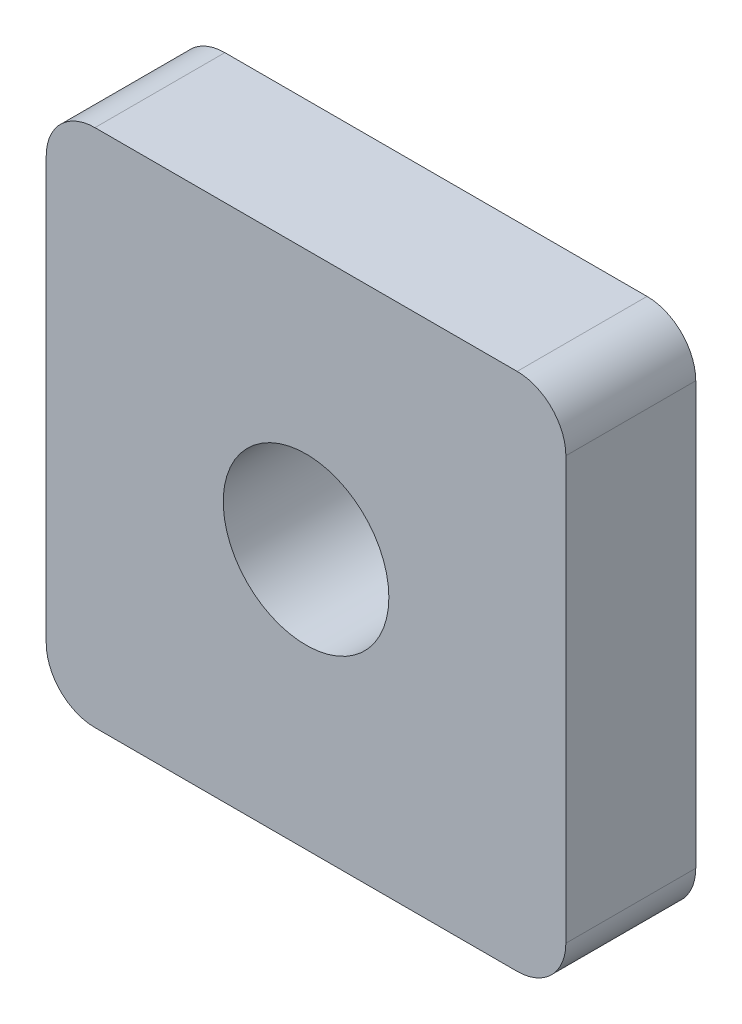
ISO-10303-21;
HEADER;
FILE_DESCRIPTION(('STEP AP214'),'2;1');
FILE_NAME('part.step','',(''),(''),'','','');
FILE_SCHEMA(('AUTOMOTIVE_DESIGN { 1 0 10303 214 1 1 1 1 }'));
ENDSEC;
DATA;
#1=APPLICATION_CONTEXT('core data for automotive mechanical design processes');
#2=APPLICATION_PROTOCOL_DEFINITION('international standard','automotive_design',2000,#1);
#3=PRODUCT_CONTEXT('',#1,'mechanical');
#4=PRODUCT('Part','Part','',(#3));
#5=PRODUCT_RELATED_PRODUCT_CATEGORY('part','',(#4));
#6=PRODUCT_DEFINITION_FORMATION('','',#4);
#7=PRODUCT_DEFINITION_CONTEXT('part definition',#1,'design');
#8=PRODUCT_DEFINITION('design','',#6,#7);
#9=PRODUCT_DEFINITION_SHAPE('','',#8);
#10=(LENGTH_UNIT() NAMED_UNIT(*) SI_UNIT(.MILLI.,.METRE.));
#11=(NAMED_UNIT(*) PLANE_ANGLE_UNIT() SI_UNIT($,.RADIAN.));
#12=(NAMED_UNIT(*) SI_UNIT($,.STERADIAN.) SOLID_ANGLE_UNIT());
#13=UNCERTAINTY_MEASURE_WITH_UNIT(LENGTH_MEASURE(1.E-05),#10,'distance_accuracy_value','');
#14=(GEOMETRIC_REPRESENTATION_CONTEXT(3) GLOBAL_UNCERTAINTY_ASSIGNED_CONTEXT((#13)) GLOBAL_UNIT_ASSIGNED_CONTEXT((#10,
#11,#12)) REPRESENTATION_CONTEXT('',''));
#15=CARTESIAN_POINT('',(0.,0.,0.));
#16=DIRECTION('',(0.,0.,1.));
#17=DIRECTION('',(1.,0.,0.));
#18=AXIS2_PLACEMENT_3D('',#15,#16,#17);
#19=CARTESIAN_POINT('',(16.,16.,8.));
#20=DIRECTION('',(-1.,0.,0.));
#21=DIRECTION('',(0.,-1.,0.));
#22=AXIS2_PLACEMENT_3D('',#19,#20,#21);
#23=PLANE('',#22);
#24=DIRECTION('',(0.,1.,0.));
#25=VECTOR('',#24,1.);
#26=CARTESIAN_POINT('',(16.,16.,8.));
#27=LINE('',#26,#25);
#28=CARTESIAN_POINT('',(16.,-13.,8.));
#29=VERTEX_POINT('',#28);
#30=CARTESIAN_POINT('',(16.,13.,8.));
#31=VERTEX_POINT('',#30);
#32=EDGE_CURVE('E131',#29,#31,#27,.T.);
#33=ORIENTED_EDGE('',*,*,#32,.F.);
#34=DIRECTION('',(0.,0.,-1.));
#35=VECTOR('',#34,1.);
#36=CARTESIAN_POINT('',(16.,-13.,8.));
#37=LINE('',#36,#35);
#38=CARTESIAN_POINT('',(16.,-13.,0.));
#39=VERTEX_POINT('',#38);
#40=EDGE_CURVE('E157',#29,#39,#37,.T.);
#41=ORIENTED_EDGE('',*,*,#40,.T.);
#42=DIRECTION('',(0.,1.,0.));
#43=VECTOR('',#42,1.);
#44=CARTESIAN_POINT('',(16.,16.,0.));
#45=LINE('',#44,#43);
#46=CARTESIAN_POINT('',(16.,13.,0.));
#47=VERTEX_POINT('',#46);
#48=EDGE_CURVE('E163',#39,#47,#45,.T.);
#49=ORIENTED_EDGE('',*,*,#48,.T.);
#50=DIRECTION('',(0.,0.,-1.));
#51=VECTOR('',#50,1.);
#52=CARTESIAN_POINT('',(16.,13.,8.));
#53=LINE('',#52,#51);
#54=EDGE_CURVE('E155',#47,#31,#53,.F.);
#55=ORIENTED_EDGE('',*,*,#54,.T.);
#56=EDGE_LOOP('',(#33,#41,#49,#55));
#57=FACE_BOUND('',#56,.T.);
#58=ADVANCED_FACE('F39',(#57),#23,.F.);
#59=CARTESIAN_POINT('',(-16.,16.,8.));
#60=DIRECTION('',(0.,-1.,0.));
#61=DIRECTION('',(0.,0.,-1.));
#62=AXIS2_PLACEMENT_3D('',#59,#60,#61);
#63=PLANE('',#62);
#64=DIRECTION('',(-1.,0.,0.));
#65=VECTOR('',#64,1.);
#66=CARTESIAN_POINT('',(-16.,16.,8.));
#67=LINE('',#66,#65);
#68=CARTESIAN_POINT('',(13.,16.,8.));
#69=VERTEX_POINT('',#68);
#70=CARTESIAN_POINT('',(-13.,16.,8.));
#71=VERTEX_POINT('',#70);
#72=EDGE_CURVE('E134',#69,#71,#67,.T.);
#73=ORIENTED_EDGE('',*,*,#72,.F.);
#74=DIRECTION('',(0.,0.,-1.));
#75=VECTOR('',#74,1.);
#76=CARTESIAN_POINT('',(13.,16.,8.));
#77=LINE('',#76,#75);
#78=CARTESIAN_POINT('',(13.,16.,0.));
#79=VERTEX_POINT('',#78);
#80=EDGE_CURVE('E11',#69,#79,#77,.T.);
#81=ORIENTED_EDGE('',*,*,#80,.T.);
#82=DIRECTION('',(-1.,0.,0.));
#83=VECTOR('',#82,1.);
#84=CARTESIAN_POINT('',(-16.,16.,0.));
#85=LINE('',#84,#83);
#86=CARTESIAN_POINT('',(-13.,16.,0.));
#87=VERTEX_POINT('',#86);
#88=EDGE_CURVE('E136',#79,#87,#85,.T.);
#89=ORIENTED_EDGE('',*,*,#88,.T.);
#90=DIRECTION('',(0.,0.,-1.));
#91=VECTOR('',#90,1.);
#92=CARTESIAN_POINT('',(-13.,16.,8.));
#93=LINE('',#92,#91);
#94=EDGE_CURVE('E47',#87,#71,#93,.F.);
#95=ORIENTED_EDGE('',*,*,#94,.T.);
#96=EDGE_LOOP('',(#73,#81,#89,#95));
#97=FACE_BOUND('',#96,.T.);
#98=ADVANCED_FACE('F193',(#97),#63,.F.);
#99=CARTESIAN_POINT('',(-16.,16.,8.));
#100=DIRECTION('',(1.,0.,0.));
#101=DIRECTION('',(0.,1.,0.));
#102=AXIS2_PLACEMENT_3D('',#99,#100,#101);
#103=PLANE('',#102);
#104=DIRECTION('',(0.,-1.,0.));
#105=VECTOR('',#104,1.);
#106=CARTESIAN_POINT('',(-16.,16.,0.));
#107=LINE('',#106,#105);
#108=CARTESIAN_POINT('',(-16.,13.,0.));
#109=VERTEX_POINT('',#108);
#110=CARTESIAN_POINT('',(-16.,-13.,0.));
#111=VERTEX_POINT('',#110);
#112=EDGE_CURVE('E132',#109,#111,#107,.T.);
#113=ORIENTED_EDGE('',*,*,#112,.T.);
#114=DIRECTION('',(0.,0.,-1.));
#115=VECTOR('',#114,1.);
#116=CARTESIAN_POINT('',(-16.,-13.,8.));
#117=LINE('',#116,#115);
#118=CARTESIAN_POINT('',(-16.,-13.,8.));
#119=VERTEX_POINT('',#118);
#120=EDGE_CURVE('E110',#111,#119,#117,.F.);
#121=ORIENTED_EDGE('',*,*,#120,.T.);
#122=DIRECTION('',(0.,-1.,0.));
#123=VECTOR('',#122,1.);
#124=CARTESIAN_POINT('',(-16.,16.,8.));
#125=LINE('',#124,#123);
#126=CARTESIAN_POINT('',(-16.,13.,8.));
#127=VERTEX_POINT('',#126);
#128=EDGE_CURVE('E175',#127,#119,#125,.T.);
#129=ORIENTED_EDGE('',*,*,#128,.F.);
#130=DIRECTION('',(0.,0.,-1.));
#131=VECTOR('',#130,1.);
#132=CARTESIAN_POINT('',(-16.,13.,8.));
#133=LINE('',#132,#131);
#134=EDGE_CURVE('E115',#127,#109,#133,.T.);
#135=ORIENTED_EDGE('',*,*,#134,.T.);
#136=EDGE_LOOP('',(#113,#121,#129,#135));
#137=FACE_BOUND('',#136,.T.);
#138=ADVANCED_FACE('F191',(#137),#103,.F.);
#139=CARTESIAN_POINT('',(-16.,-16.,8.));
#140=DIRECTION('',(0.,1.,0.));
#141=DIRECTION('',(-1.,0.,0.));
#142=AXIS2_PLACEMENT_3D('',#139,#140,#141);
#143=PLANE('',#142);
#144=DIRECTION('',(1.,0.,0.));
#145=VECTOR('',#144,1.);
#146=CARTESIAN_POINT('',(-16.,-16.,8.));
#147=LINE('',#146,#145);
#148=CARTESIAN_POINT('',(-13.,-16.,8.));
#149=VERTEX_POINT('',#148);
#150=CARTESIAN_POINT('',(13.,-16.,8.));
#151=VERTEX_POINT('',#150);
#152=EDGE_CURVE('E125',#149,#151,#147,.T.);
#153=ORIENTED_EDGE('',*,*,#152,.F.);
#154=DIRECTION('',(0.,0.,-1.));
#155=VECTOR('',#154,1.);
#156=CARTESIAN_POINT('',(-13.,-16.,8.));
#157=LINE('',#156,#155);
#158=CARTESIAN_POINT('',(-13.,-16.,0.));
#159=VERTEX_POINT('',#158);
#160=EDGE_CURVE('E109',#149,#159,#157,.T.);
#161=ORIENTED_EDGE('',*,*,#160,.T.);
#162=DIRECTION('',(1.,0.,0.));
#163=VECTOR('',#162,1.);
#164=CARTESIAN_POINT('',(-16.,-16.,0.));
#165=LINE('',#164,#163);
#166=CARTESIAN_POINT('',(13.,-16.,0.));
#167=VERTEX_POINT('',#166);
#168=EDGE_CURVE('E122',#159,#167,#165,.T.);
#169=ORIENTED_EDGE('',*,*,#168,.T.);
#170=DIRECTION('',(0.,0.,-1.));
#171=VECTOR('',#170,1.);
#172=CARTESIAN_POINT('',(13.,-16.,8.));
#173=LINE('',#172,#171);
#174=EDGE_CURVE('E127',#167,#151,#173,.F.);
#175=ORIENTED_EDGE('',*,*,#174,.T.);
#176=EDGE_LOOP('',(#153,#161,#169,#175));
#177=FACE_BOUND('',#176,.T.);
#178=ADVANCED_FACE('F121',(#177),#143,.F.);
#179=CARTESIAN_POINT('',(0.,0.,8.));
#180=DIRECTION('',(0.,0.,1.));
#181=DIRECTION('',(1.,0.,0.));
#182=AXIS2_PLACEMENT_3D('',#179,#180,#181);
#183=PLANE('',#182);
#184=CARTESIAN_POINT('',(0.,0.,8.));
#185=DIRECTION('',(0.,0.,1.));
#186=DIRECTION('',(1.,0.,0.));
#187=AXIS2_PLACEMENT_3D('',#184,#185,#186);
#188=CIRCLE('',#187,5.1);
#189=CARTESIAN_POINT('',(5.1,0.,8.));
#190=VERTEX_POINT('',#189);
#191=EDGE_CURVE('E171',#190,#190,#188,.T.);
#192=ORIENTED_EDGE('',*,*,#191,.F.);
#193=EDGE_LOOP('',(#192));
#194=FACE_BOUND('',#193,.T.);
#195=ORIENTED_EDGE('',*,*,#128,.T.);
#196=CARTESIAN_POINT('',(-13.,-13.,8.));
#197=DIRECTION('',(0.,0.,1.));
#198=DIRECTION('',(1.,0.,0.));
#199=AXIS2_PLACEMENT_3D('',#196,#197,#198);
#200=CIRCLE('',#199,3.);
#201=EDGE_CURVE('E153',#119,#149,#200,.T.);
#202=ORIENTED_EDGE('',*,*,#201,.T.);
#203=ORIENTED_EDGE('',*,*,#152,.T.);
#204=CARTESIAN_POINT('',(13.,-13.,8.));
#205=DIRECTION('',(0.,0.,1.));
#206=DIRECTION('',(1.,0.,0.));
#207=AXIS2_PLACEMENT_3D('',#204,#205,#206);
#208=CIRCLE('',#207,3.);
#209=EDGE_CURVE('E151',#151,#29,#208,.T.);
#210=ORIENTED_EDGE('',*,*,#209,.T.);
#211=ORIENTED_EDGE('',*,*,#32,.T.);
#212=CARTESIAN_POINT('',(13.,13.,8.));
#213=DIRECTION('',(0.,0.,1.));
#214=DIRECTION('',(1.,0.,0.));
#215=AXIS2_PLACEMENT_3D('',#212,#213,#214);
#216=CIRCLE('',#215,3.);
#217=EDGE_CURVE('E60',#31,#69,#216,.T.);
#218=ORIENTED_EDGE('',*,*,#217,.T.);
#219=ORIENTED_EDGE('',*,*,#72,.T.);
#220=CARTESIAN_POINT('',(-13.,13.,8.));
#221=DIRECTION('',(0.,0.,1.));
#222=DIRECTION('',(1.,0.,0.));
#223=AXIS2_PLACEMENT_3D('',#220,#221,#222);
#224=CIRCLE('',#223,3.);
#225=EDGE_CURVE('E148',#71,#127,#224,.T.);
#226=ORIENTED_EDGE('',*,*,#225,.T.);
#227=EDGE_LOOP('',(#195,#202,#203,#210,#211,#218,#219,#226));
#228=FACE_BOUND('',#227,.T.);
#229=ADVANCED_FACE('F184',(#194,#228),#183,.T.);
#230=CARTESIAN_POINT('',(0.,0.,0.));
#231=DIRECTION('',(0.,0.,1.));
#232=DIRECTION('',(1.,0.,0.));
#233=AXIS2_PLACEMENT_3D('',#230,#231,#232);
#234=PLANE('',#233);
#235=CARTESIAN_POINT('',(0.,0.,0.));
#236=DIRECTION('',(0.,0.,1.));
#237=DIRECTION('',(1.,0.,0.));
#238=AXIS2_PLACEMENT_3D('',#235,#236,#237);
#239=CIRCLE('',#238,5.1);
#240=CARTESIAN_POINT('',(5.1,0.,0.));
#241=VERTEX_POINT('',#240);
#242=EDGE_CURVE('E168',#241,#241,#239,.T.);
#243=ORIENTED_EDGE('',*,*,#242,.T.);
#244=EDGE_LOOP('',(#243));
#245=FACE_BOUND('',#244,.T.);
#246=ORIENTED_EDGE('',*,*,#168,.F.);
#247=CARTESIAN_POINT('',(-13.,-13.,0.));
#248=DIRECTION('',(0.,0.,1.));
#249=DIRECTION('',(1.,0.,0.));
#250=AXIS2_PLACEMENT_3D('',#247,#248,#249);
#251=CIRCLE('',#250,3.);
#252=EDGE_CURVE('E105',#159,#111,#251,.F.);
#253=ORIENTED_EDGE('',*,*,#252,.T.);
#254=ORIENTED_EDGE('',*,*,#112,.F.);
#255=CARTESIAN_POINT('',(-13.,13.,0.));
#256=DIRECTION('',(0.,0.,1.));
#257=DIRECTION('',(1.,0.,0.));
#258=AXIS2_PLACEMENT_3D('',#255,#256,#257);
#259=CIRCLE('',#258,3.);
#260=EDGE_CURVE('E126',#109,#87,#259,.F.);
#261=ORIENTED_EDGE('',*,*,#260,.T.);
#262=ORIENTED_EDGE('',*,*,#88,.F.);
#263=CARTESIAN_POINT('',(13.,13.,0.));
#264=DIRECTION('',(0.,0.,1.));
#265=DIRECTION('',(1.,0.,0.));
#266=AXIS2_PLACEMENT_3D('',#263,#264,#265);
#267=CIRCLE('',#266,3.);
#268=EDGE_CURVE('E142',#79,#47,#267,.F.);
#269=ORIENTED_EDGE('',*,*,#268,.T.);
#270=ORIENTED_EDGE('',*,*,#48,.F.);
#271=CARTESIAN_POINT('',(13.,-13.,0.));
#272=DIRECTION('',(0.,0.,1.));
#273=DIRECTION('',(1.,0.,0.));
#274=AXIS2_PLACEMENT_3D('',#271,#272,#273);
#275=CIRCLE('',#274,3.);
#276=EDGE_CURVE('E116',#39,#167,#275,.F.);
#277=ORIENTED_EDGE('',*,*,#276,.T.);
#278=EDGE_LOOP('',(#246,#253,#254,#261,#262,#269,#270,#277));
#279=FACE_BOUND('',#278,.T.);
#280=ADVANCED_FACE('F129',(#245,#279),#234,.F.);
#281=CARTESIAN_POINT('',(0.,0.,0.));
#282=DIRECTION('',(0.,0.,1.));
#283=DIRECTION('',(1.,0.,0.));
#284=AXIS2_PLACEMENT_3D('',#281,#282,#283);
#285=CYLINDRICAL_SURFACE('',#284,5.1);
#286=ORIENTED_EDGE('',*,*,#242,.F.);
#287=EDGE_LOOP('',(#286));
#288=FACE_BOUND('',#287,.T.);
#289=ORIENTED_EDGE('',*,*,#191,.T.);
#290=EDGE_LOOP('',(#289));
#291=FACE_BOUND('',#290,.T.);
#292=ADVANCED_FACE('F182',(#288,#291),#285,.F.);
#293=CARTESIAN_POINT('',(-13.,-13.,8.));
#294=DIRECTION('',(0.,0.,-1.));
#295=DIRECTION('',(-1.,0.,0.));
#296=AXIS2_PLACEMENT_3D('',#293,#294,#295);
#297=CYLINDRICAL_SURFACE('',#296,3.);
#298=ORIENTED_EDGE('',*,*,#201,.F.);
#299=ORIENTED_EDGE('',*,*,#120,.F.);
#300=ORIENTED_EDGE('',*,*,#252,.F.);
#301=ORIENTED_EDGE('',*,*,#160,.F.);
#302=EDGE_LOOP('',(#298,#299,#300,#301));
#303=FACE_BOUND('',#302,.T.);
#304=ADVANCED_FACE('F108',(#303),#297,.T.);
#305=CARTESIAN_POINT('',(13.,-13.,8.));
#306=DIRECTION('',(0.,0.,-1.));
#307=DIRECTION('',(-1.,0.,0.));
#308=AXIS2_PLACEMENT_3D('',#305,#306,#307);
#309=CYLINDRICAL_SURFACE('',#308,3.);
#310=ORIENTED_EDGE('',*,*,#209,.F.);
#311=ORIENTED_EDGE('',*,*,#174,.F.);
#312=ORIENTED_EDGE('',*,*,#276,.F.);
#313=ORIENTED_EDGE('',*,*,#40,.F.);
#314=EDGE_LOOP('',(#310,#311,#312,#313));
#315=FACE_BOUND('',#314,.T.);
#316=ADVANCED_FACE('F197',(#315),#309,.T.);
#317=CARTESIAN_POINT('',(13.,13.,8.));
#318=DIRECTION('',(0.,0.,-1.));
#319=DIRECTION('',(-1.,0.,0.));
#320=AXIS2_PLACEMENT_3D('',#317,#318,#319);
#321=CYLINDRICAL_SURFACE('',#320,3.);
#322=ORIENTED_EDGE('',*,*,#217,.F.);
#323=ORIENTED_EDGE('',*,*,#54,.F.);
#324=ORIENTED_EDGE('',*,*,#268,.F.);
#325=ORIENTED_EDGE('',*,*,#80,.F.);
#326=EDGE_LOOP('',(#322,#323,#324,#325));
#327=FACE_BOUND('',#326,.T.);
#328=ADVANCED_FACE('F196',(#327),#321,.T.);
#329=CARTESIAN_POINT('',(-13.,13.,8.));
#330=DIRECTION('',(0.,0.,-1.));
#331=DIRECTION('',(-1.,0.,0.));
#332=AXIS2_PLACEMENT_3D('',#329,#330,#331);
#333=CYLINDRICAL_SURFACE('',#332,3.);
#334=ORIENTED_EDGE('',*,*,#225,.F.);
#335=ORIENTED_EDGE('',*,*,#94,.F.);
#336=ORIENTED_EDGE('',*,*,#260,.F.);
#337=ORIENTED_EDGE('',*,*,#134,.F.);
#338=EDGE_LOOP('',(#334,#335,#336,#337));
#339=FACE_BOUND('',#338,.T.);
#340=ADVANCED_FACE('F41',(#339),#333,.T.);
#341=CLOSED_SHELL('',(#58,#98,#138,#178,#229,#280,#292,#304,#316,#328,#340));
#342=MANIFOLD_SOLID_BREP('B2',#341);
#343=ADVANCED_BREP_SHAPE_REPRESENTATION('',(#18,#342),#14);
#344=SHAPE_DEFINITION_REPRESENTATION(#9,#343);
ENDSEC;
END-ISO-10303-21;
